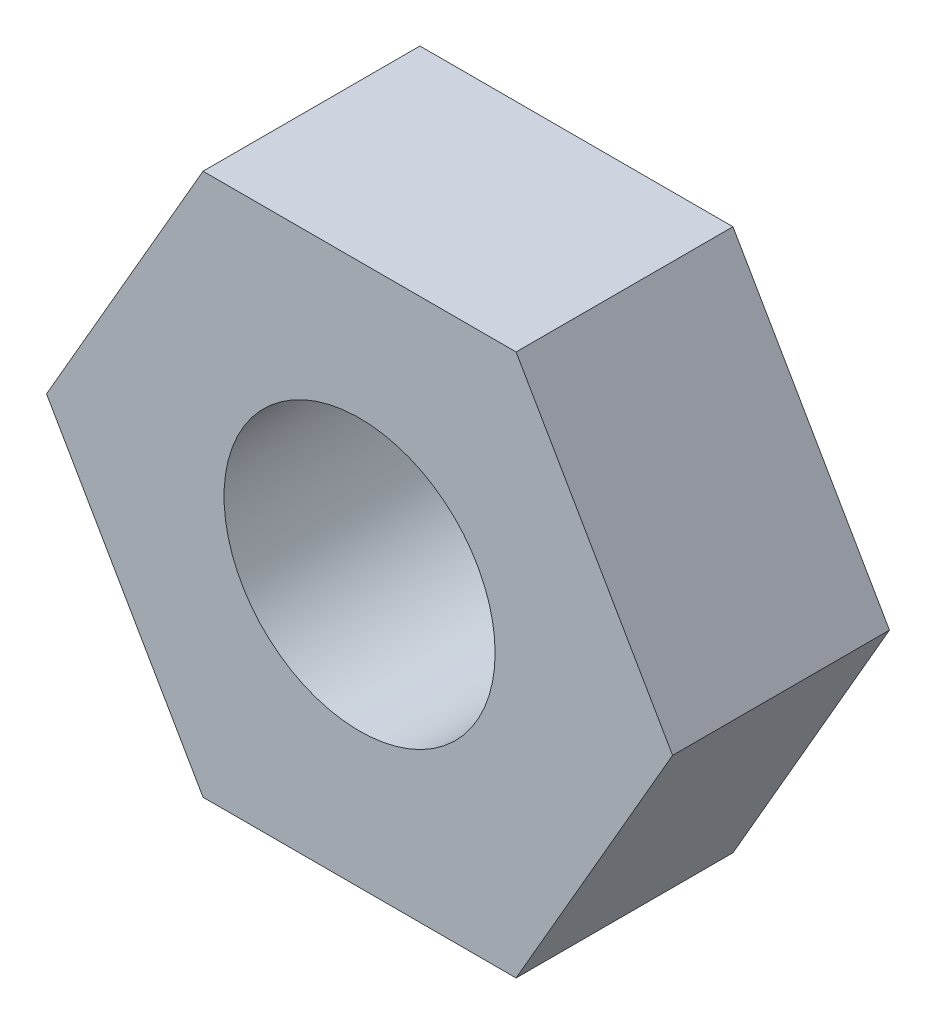
ISO-10303-21;
HEADER;
FILE_DESCRIPTION(('STEP AP214'),'2;1');
FILE_NAME('part.step','',(''),(''),'','','');
FILE_SCHEMA(('AUTOMOTIVE_DESIGN { 1 0 10303 214 1 1 1 1 }'));
ENDSEC;
DATA;
#1=APPLICATION_CONTEXT('core data for automotive mechanical design processes');
#2=APPLICATION_PROTOCOL_DEFINITION('international standard','automotive_design',2000,#1);
#3=PRODUCT_CONTEXT('',#1,'mechanical');
#4=PRODUCT('Part','Part','',(#3));
#5=PRODUCT_RELATED_PRODUCT_CATEGORY('part','',(#4));
#6=PRODUCT_DEFINITION_FORMATION('','',#4);
#7=PRODUCT_DEFINITION_CONTEXT('part definition',#1,'design');
#8=PRODUCT_DEFINITION('design','',#6,#7);
#9=PRODUCT_DEFINITION_SHAPE('','',#8);
#10=(LENGTH_UNIT() NAMED_UNIT(*) SI_UNIT(.MILLI.,.METRE.));
#11=(NAMED_UNIT(*) PLANE_ANGLE_UNIT() SI_UNIT($,.RADIAN.));
#12=(NAMED_UNIT(*) SI_UNIT($,.STERADIAN.) SOLID_ANGLE_UNIT());
#13=UNCERTAINTY_MEASURE_WITH_UNIT(LENGTH_MEASURE(1.E-05),#10,'distance_accuracy_value','');
#14=(GEOMETRIC_REPRESENTATION_CONTEXT(3) GLOBAL_UNCERTAINTY_ASSIGNED_CONTEXT((#13)) GLOBAL_UNIT_ASSIGNED_CONTEXT((#10,
#11,#12)) REPRESENTATION_CONTEXT('',''));
#15=CARTESIAN_POINT('',(0.,0.,0.));
#16=DIRECTION('',(0.,0.,1.));
#17=DIRECTION('',(1.,0.,0.));
#18=AXIS2_PLACEMENT_3D('',#15,#16,#17);
#19=CARTESIAN_POINT('',(1.15470053837928,-1.99999999999999,1.6));
#20=DIRECTION('',(-0.866025403784441,0.499999999999995,0.));
#21=DIRECTION('',(-0.499999999999995,-0.866025403784442,0.));
#22=AXIS2_PLACEMENT_3D('',#19,#20,#21);
#23=PLANE('',#22);
#24=DIRECTION('',(0.499999999999995,0.866025403784441,0.));
#25=VECTOR('',#24,1.);
#26=CARTESIAN_POINT('',(1.15470053837928,-1.99999999999999,0.));
#27=LINE('',#26,#25);
#28=CARTESIAN_POINT('',(1.15470053837928,-1.99999999999999,0.));
#29=VERTEX_POINT('',#28);
#30=CARTESIAN_POINT('',(2.30940107675851,0.,0.));
#31=VERTEX_POINT('',#30);
#32=EDGE_CURVE('E116',#29,#31,#27,.T.);
#33=ORIENTED_EDGE('',*,*,#32,.T.);
#34=DIRECTION('',(0.,0.,-1.));
#35=VECTOR('',#34,1.);
#36=CARTESIAN_POINT('',(2.30940107675851,0.,1.6));
#37=LINE('',#36,#35);
#38=CARTESIAN_POINT('',(2.30940107675851,0.,1.6));
#39=VERTEX_POINT('',#38);
#40=EDGE_CURVE('E11',#39,#31,#37,.T.);
#41=ORIENTED_EDGE('',*,*,#40,.F.);
#42=DIRECTION('',(0.499999999999995,0.866025403784441,0.));
#43=VECTOR('',#42,1.);
#44=CARTESIAN_POINT('',(1.15470053837928,-1.99999999999999,1.6));
#45=LINE('',#44,#43);
#46=CARTESIAN_POINT('',(1.15470053837928,-1.99999999999999,1.6));
#47=VERTEX_POINT('',#46);
#48=EDGE_CURVE('E127',#47,#39,#45,.T.);
#49=ORIENTED_EDGE('',*,*,#48,.F.);
#50=DIRECTION('',(0.,0.,-1.));
#51=VECTOR('',#50,1.);
#52=CARTESIAN_POINT('',(1.15470053837928,-1.99999999999999,1.6));
#53=LINE('',#52,#51);
#54=EDGE_CURVE('E112',#47,#29,#53,.T.);
#55=ORIENTED_EDGE('',*,*,#54,.T.);
#56=EDGE_LOOP('',(#33,#41,#49,#55));
#57=FACE_BOUND('',#56,.T.);
#58=ADVANCED_FACE('F32',(#57),#23,.F.);
#59=CARTESIAN_POINT('',(2.30940107675851,0.,1.6));
#60=DIRECTION('',(-0.866025403784438,-0.500000000000001,0.));
#61=DIRECTION('',(0.500000000000001,-0.866025403784438,0.));
#62=AXIS2_PLACEMENT_3D('',#59,#60,#61);
#63=PLANE('',#62);
#64=DIRECTION('',(-0.500000000000001,0.866025403784438,0.));
#65=VECTOR('',#64,1.);
#66=CARTESIAN_POINT('',(2.30940107675851,0.,0.));
#67=LINE('',#66,#65);
#68=CARTESIAN_POINT('',(1.15470053837925,2.,0.));
#69=VERTEX_POINT('',#68);
#70=EDGE_CURVE('E119',#31,#69,#67,.T.);
#71=ORIENTED_EDGE('',*,*,#70,.T.);
#72=DIRECTION('',(0.,0.,-1.));
#73=VECTOR('',#72,1.);
#74=CARTESIAN_POINT('',(1.15470053837925,2.,1.6));
#75=LINE('',#74,#73);
#76=CARTESIAN_POINT('',(1.15470053837925,2.,1.6));
#77=VERTEX_POINT('',#76);
#78=EDGE_CURVE('E40',#77,#69,#75,.T.);
#79=ORIENTED_EDGE('',*,*,#78,.F.);
#80=DIRECTION('',(-0.500000000000001,0.866025403784438,0.));
#81=VECTOR('',#80,1.);
#82=CARTESIAN_POINT('',(2.30940107675851,0.,1.6));
#83=LINE('',#82,#81);
#84=EDGE_CURVE('E85',#39,#77,#83,.T.);
#85=ORIENTED_EDGE('',*,*,#84,.F.);
#86=ORIENTED_EDGE('',*,*,#40,.T.);
#87=EDGE_LOOP('',(#71,#79,#85,#86));
#88=FACE_BOUND('',#87,.T.);
#89=ADVANCED_FACE('F152',(#88),#63,.F.);
#90=CARTESIAN_POINT('',(1.15470053837925,2.,1.6));
#91=DIRECTION('',(0.,-1.,0.));
#92=DIRECTION('',(1.,0.,0.));
#93=AXIS2_PLACEMENT_3D('',#90,#91,#92);
#94=PLANE('',#93);
#95=DIRECTION('',(-1.,0.,0.));
#96=VECTOR('',#95,1.);
#97=CARTESIAN_POINT('',(1.15470053837925,2.,0.));
#98=LINE('',#97,#96);
#99=CARTESIAN_POINT('',(-1.15470053837926,2.,0.));
#100=VERTEX_POINT('',#99);
#101=EDGE_CURVE('E122',#69,#100,#98,.T.);
#102=ORIENTED_EDGE('',*,*,#101,.T.);
#103=DIRECTION('',(0.,0.,-1.));
#104=VECTOR('',#103,1.);
#105=CARTESIAN_POINT('',(-1.15470053837926,2.,1.6));
#106=LINE('',#105,#104);
#107=CARTESIAN_POINT('',(-1.15470053837926,2.,1.6));
#108=VERTEX_POINT('',#107);
#109=EDGE_CURVE('E107',#108,#100,#106,.T.);
#110=ORIENTED_EDGE('',*,*,#109,.F.);
#111=DIRECTION('',(-1.,0.,0.));
#112=VECTOR('',#111,1.);
#113=CARTESIAN_POINT('',(1.15470053837925,2.,1.6));
#114=LINE('',#113,#112);
#115=EDGE_CURVE('E98',#77,#108,#114,.T.);
#116=ORIENTED_EDGE('',*,*,#115,.F.);
#117=ORIENTED_EDGE('',*,*,#78,.T.);
#118=EDGE_LOOP('',(#102,#110,#116,#117));
#119=FACE_BOUND('',#118,.T.);
#120=ADVANCED_FACE('F133',(#119),#94,.F.);
#121=CARTESIAN_POINT('',(-1.15470053837926,2.,1.6));
#122=DIRECTION('',(0.866025403784441,-0.499999999999995,0.));
#123=DIRECTION('',(0.499999999999995,0.866025403784441,0.));
#124=AXIS2_PLACEMENT_3D('',#121,#122,#123);
#125=PLANE('',#124);
#126=DIRECTION('',(-0.499999999999995,-0.866025403784441,0.));
#127=VECTOR('',#126,1.);
#128=CARTESIAN_POINT('',(-1.15470053837926,2.,0.));
#129=LINE('',#128,#127);
#130=CARTESIAN_POINT('',(-2.30940107675851,0.,0.));
#131=VERTEX_POINT('',#130);
#132=EDGE_CURVE('E106',#100,#131,#129,.T.);
#133=ORIENTED_EDGE('',*,*,#132,.T.);
#134=DIRECTION('',(0.,0.,-1.));
#135=VECTOR('',#134,1.);
#136=CARTESIAN_POINT('',(-2.30940107675851,0.,1.6));
#137=LINE('',#136,#135);
#138=CARTESIAN_POINT('',(-2.30940107675851,0.,1.6));
#139=VERTEX_POINT('',#138);
#140=EDGE_CURVE('E103',#139,#131,#137,.T.);
#141=ORIENTED_EDGE('',*,*,#140,.F.);
#142=DIRECTION('',(-0.499999999999995,-0.866025403784441,0.));
#143=VECTOR('',#142,1.);
#144=CARTESIAN_POINT('',(-1.15470053837926,2.,1.6));
#145=LINE('',#144,#143);
#146=EDGE_CURVE('E92',#108,#139,#145,.T.);
#147=ORIENTED_EDGE('',*,*,#146,.F.);
#148=ORIENTED_EDGE('',*,*,#109,.T.);
#149=EDGE_LOOP('',(#133,#141,#147,#148));
#150=FACE_BOUND('',#149,.T.);
#151=ADVANCED_FACE('F104',(#150),#125,.F.);
#152=CARTESIAN_POINT('',(-2.30940107675851,0.,1.6));
#153=DIRECTION('',(0.866025403784435,0.500000000000007,0.));
#154=DIRECTION('',(-0.500000000000007,0.866025403784435,0.));
#155=AXIS2_PLACEMENT_3D('',#152,#153,#154);
#156=PLANE('',#155);
#157=DIRECTION('',(0.500000000000007,-0.866025403784434,0.));
#158=VECTOR('',#157,1.);
#159=CARTESIAN_POINT('',(-2.30940107675851,0.,0.));
#160=LINE('',#159,#158);
#161=CARTESIAN_POINT('',(-1.15470053837923,-2.00000000000001,0.));
#162=VERTEX_POINT('',#161);
#163=EDGE_CURVE('E71',#131,#162,#160,.T.);
#164=ORIENTED_EDGE('',*,*,#163,.T.);
#165=DIRECTION('',(0.,0.,-1.));
#166=VECTOR('',#165,1.);
#167=CARTESIAN_POINT('',(-1.15470053837923,-2.00000000000001,1.6));
#168=LINE('',#167,#166);
#169=CARTESIAN_POINT('',(-1.15470053837923,-2.00000000000001,1.6));
#170=VERTEX_POINT('',#169);
#171=EDGE_CURVE('E108',#170,#162,#168,.T.);
#172=ORIENTED_EDGE('',*,*,#171,.F.);
#173=DIRECTION('',(0.500000000000007,-0.866025403784434,0.));
#174=VECTOR('',#173,1.);
#175=CARTESIAN_POINT('',(-2.30940107675851,0.,1.6));
#176=LINE('',#175,#174);
#177=EDGE_CURVE('E96',#139,#170,#176,.T.);
#178=ORIENTED_EDGE('',*,*,#177,.F.);
#179=ORIENTED_EDGE('',*,*,#140,.T.);
#180=EDGE_LOOP('',(#164,#172,#178,#179));
#181=FACE_BOUND('',#180,.T.);
#182=ADVANCED_FACE('F110',(#181),#156,.F.);
#183=CARTESIAN_POINT('',(-1.15470053837923,-2.00000000000001,1.6));
#184=DIRECTION('',(0.,1.,0.));
#185=DIRECTION('',(-1.,0.,0.));
#186=AXIS2_PLACEMENT_3D('',#183,#184,#185);
#187=PLANE('',#186);
#188=DIRECTION('',(1.,0.,0.));
#189=VECTOR('',#188,1.);
#190=CARTESIAN_POINT('',(-1.15470053837923,-2.00000000000001,0.));
#191=LINE('',#190,#189);
#192=EDGE_CURVE('E77',#162,#29,#191,.T.);
#193=ORIENTED_EDGE('',*,*,#192,.T.);
#194=ORIENTED_EDGE('',*,*,#54,.F.);
#195=DIRECTION('',(1.,0.,0.));
#196=VECTOR('',#195,1.);
#197=CARTESIAN_POINT('',(-1.15470053837923,-2.00000000000001,1.6));
#198=LINE('',#197,#196);
#199=EDGE_CURVE('E48',#170,#47,#198,.T.);
#200=ORIENTED_EDGE('',*,*,#199,.F.);
#201=ORIENTED_EDGE('',*,*,#171,.T.);
#202=EDGE_LOOP('',(#193,#194,#200,#201));
#203=FACE_BOUND('',#202,.T.);
#204=ADVANCED_FACE('F140',(#203),#187,.F.);
#205=CARTESIAN_POINT('',(0.,0.,1.6));
#206=DIRECTION('',(0.,0.,1.));
#207=DIRECTION('',(1.,0.,0.));
#208=AXIS2_PLACEMENT_3D('',#205,#206,#207);
#209=PLANE('',#208);
#210=CARTESIAN_POINT('',(0.,0.,1.6));
#211=DIRECTION('',(0.,0.,1.));
#212=DIRECTION('',(1.,0.,0.));
#213=AXIS2_PLACEMENT_3D('',#210,#211,#212);
#214=CIRCLE('',#213,1.);
#215=CARTESIAN_POINT('',(1.,0.,1.6));
#216=VERTEX_POINT('',#215);
#217=EDGE_CURVE('E207',#216,#216,#214,.T.);
#218=ORIENTED_EDGE('',*,*,#217,.F.);
#219=EDGE_LOOP('',(#218));
#220=FACE_BOUND('',#219,.T.);
#221=ORIENTED_EDGE('',*,*,#48,.T.);
#222=ORIENTED_EDGE('',*,*,#84,.T.);
#223=ORIENTED_EDGE('',*,*,#115,.T.);
#224=ORIENTED_EDGE('',*,*,#146,.T.);
#225=ORIENTED_EDGE('',*,*,#177,.T.);
#226=ORIENTED_EDGE('',*,*,#199,.T.);
#227=EDGE_LOOP('',(#221,#222,#223,#224,#225,#226));
#228=FACE_BOUND('',#227,.T.);
#229=ADVANCED_FACE('F94',(#220,#228),#209,.T.);
#230=CARTESIAN_POINT('',(0.,0.,0.));
#231=DIRECTION('',(0.,0.,1.));
#232=DIRECTION('',(1.,0.,0.));
#233=AXIS2_PLACEMENT_3D('',#230,#231,#232);
#234=PLANE('',#233);
#235=CARTESIAN_POINT('',(0.,0.,0.));
#236=DIRECTION('',(0.,0.,1.));
#237=DIRECTION('',(1.,0.,0.));
#238=AXIS2_PLACEMENT_3D('',#235,#236,#237);
#239=CIRCLE('',#238,1.);
#240=CARTESIAN_POINT('',(1.,0.,0.));
#241=VERTEX_POINT('',#240);
#242=EDGE_CURVE('E120',#241,#241,#239,.T.);
#243=ORIENTED_EDGE('',*,*,#242,.T.);
#244=EDGE_LOOP('',(#243));
#245=FACE_BOUND('',#244,.T.);
#246=ORIENTED_EDGE('',*,*,#32,.F.);
#247=ORIENTED_EDGE('',*,*,#192,.F.);
#248=ORIENTED_EDGE('',*,*,#163,.F.);
#249=ORIENTED_EDGE('',*,*,#132,.F.);
#250=ORIENTED_EDGE('',*,*,#101,.F.);
#251=ORIENTED_EDGE('',*,*,#70,.F.);
#252=EDGE_LOOP('',(#246,#247,#248,#249,#250,#251));
#253=FACE_BOUND('',#252,.T.);
#254=ADVANCED_FACE('F136',(#245,#253),#234,.F.);
#255=CARTESIAN_POINT('',(0.,0.,0.));
#256=DIRECTION('',(0.,0.,1.));
#257=DIRECTION('',(1.,0.,0.));
#258=AXIS2_PLACEMENT_3D('',#255,#256,#257);
#259=CYLINDRICAL_SURFACE('',#258,1.);
#260=ORIENTED_EDGE('',*,*,#242,.F.);
#261=EDGE_LOOP('',(#260));
#262=FACE_BOUND('',#261,.T.);
#263=ORIENTED_EDGE('',*,*,#217,.T.);
#264=EDGE_LOOP('',(#263));
#265=FACE_BOUND('',#264,.T.);
#266=ADVANCED_FACE('F189',(#262,#265),#259,.F.);
#267=CLOSED_SHELL('',(#58,#89,#120,#151,#182,#204,#229,#254,#266));
#268=MANIFOLD_SOLID_BREP('B2',#267);
#269=ADVANCED_BREP_SHAPE_REPRESENTATION('',(#18,#268),#14);
#270=SHAPE_DEFINITION_REPRESENTATION(#9,#269);
ENDSEC;
END-ISO-10303-21;
